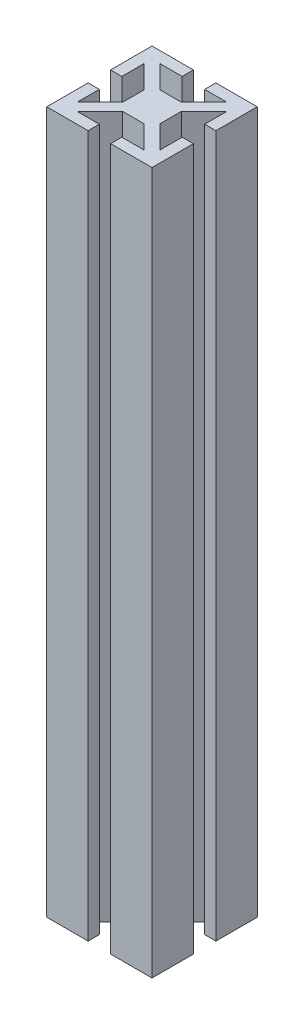
ISO-10303-21;
HEADER;
FILE_DESCRIPTION(('STEP AP214'),'2;1');
FILE_NAME('part.step','',(''),(''),'','','');
FILE_SCHEMA(('AUTOMOTIVE_DESIGN { 1 0 10303 214 1 1 1 1 }'));
ENDSEC;
DATA;
#1=APPLICATION_CONTEXT('core data for automotive mechanical design processes');
#2=APPLICATION_PROTOCOL_DEFINITION('international standard','automotive_design',2000,#1);
#3=PRODUCT_CONTEXT('',#1,'mechanical');
#4=PRODUCT('Part','Part','',(#3));
#5=PRODUCT_RELATED_PRODUCT_CATEGORY('part','',(#4));
#6=PRODUCT_DEFINITION_FORMATION('','',#4);
#7=PRODUCT_DEFINITION_CONTEXT('part definition',#1,'design');
#8=PRODUCT_DEFINITION('design','',#6,#7);
#9=PRODUCT_DEFINITION_SHAPE('','',#8);
#10=(LENGTH_UNIT() NAMED_UNIT(*) SI_UNIT(.MILLI.,.METRE.));
#11=(NAMED_UNIT(*) PLANE_ANGLE_UNIT() SI_UNIT($,.RADIAN.));
#12=(NAMED_UNIT(*) SI_UNIT($,.STERADIAN.) SOLID_ANGLE_UNIT());
#13=UNCERTAINTY_MEASURE_WITH_UNIT(LENGTH_MEASURE(1.E-05),#10,'distance_accuracy_value','');
#14=(GEOMETRIC_REPRESENTATION_CONTEXT(3) GLOBAL_UNCERTAINTY_ASSIGNED_CONTEXT((#13)) GLOBAL_UNIT_ASSIGNED_CONTEXT((#10,
#11,#12)) REPRESENTATION_CONTEXT('',''));
#15=CARTESIAN_POINT('',(0.,0.,0.));
#16=DIRECTION('',(0.,0.,1.));
#17=DIRECTION('',(1.,0.,0.));
#18=AXIS2_PLACEMENT_3D('',#15,#16,#17);
#19=CARTESIAN_POINT('',(-19.05,-254.,-19.05));
#20=DIRECTION('',(-1.,0.,0.));
#21=DIRECTION('',(0.,0.,1.));
#22=AXIS2_PLACEMENT_3D('',#19,#20,#21);
#23=PLANE('',#22);
#24=DIRECTION('',(0.,0.,1.));
#25=VECTOR('',#24,1.);
#26=CARTESIAN_POINT('',(-19.05,0.,-19.05));
#27=LINE('',#26,#25);
#28=CARTESIAN_POINT('',(-19.05,0.,-19.05));
#29=VERTEX_POINT('',#28);
#30=CARTESIAN_POINT('',(-19.05,0.,-4.06399999999998));
#31=VERTEX_POINT('',#30);
#32=EDGE_CURVE('E296',#29,#31,#27,.T.);
#33=ORIENTED_EDGE('',*,*,#32,.F.);
#34=DIRECTION('',(0.,1.,0.));
#35=VECTOR('',#34,1.);
#36=CARTESIAN_POINT('',(-19.05,-254.,-19.05));
#37=LINE('',#36,#35);
#38=CARTESIAN_POINT('',(-19.05,-254.,-19.05));
#39=VERTEX_POINT('',#38);
#40=EDGE_CURVE('E11',#39,#29,#37,.T.);
#41=ORIENTED_EDGE('',*,*,#40,.F.);
#42=DIRECTION('',(0.,0.,1.));
#43=VECTOR('',#42,1.);
#44=CARTESIAN_POINT('',(-19.05,-254.,-19.05));
#45=LINE('',#44,#43);
#46=CARTESIAN_POINT('',(-19.05,-254.,-4.06399999999998));
#47=VERTEX_POINT('',#46);
#48=EDGE_CURVE('E400',#39,#47,#45,.T.);
#49=ORIENTED_EDGE('',*,*,#48,.T.);
#50=DIRECTION('',(0.,1.,0.));
#51=VECTOR('',#50,1.);
#52=CARTESIAN_POINT('',(-19.05,-254.,-4.06399999999998));
#53=LINE('',#52,#51);
#54=EDGE_CURVE('E34',#47,#31,#53,.T.);
#55=ORIENTED_EDGE('',*,*,#54,.T.);
#56=EDGE_LOOP('',(#33,#41,#49,#55));
#57=FACE_BOUND('',#56,.T.);
#58=ADVANCED_FACE('F31',(#57),#23,.T.);
#59=CARTESIAN_POINT('',(-19.05,-254.,-19.05));
#60=DIRECTION('',(0.,0.,-1.));
#61=DIRECTION('',(-1.,0.,0.));
#62=AXIS2_PLACEMENT_3D('',#59,#60,#61);
#63=PLANE('',#62);
#64=DIRECTION('',(-1.,0.,0.));
#65=VECTOR('',#64,1.);
#66=CARTESIAN_POINT('',(-19.05,0.,-19.05));
#67=LINE('',#66,#65);
#68=CARTESIAN_POINT('',(-4.064,0.,-19.05));
#69=VERTEX_POINT('',#68);
#70=EDGE_CURVE('E398',#69,#29,#67,.T.);
#71=ORIENTED_EDGE('',*,*,#70,.F.);
#72=DIRECTION('',(0.,1.,0.));
#73=VECTOR('',#72,1.);
#74=CARTESIAN_POINT('',(-4.064,-254.,-19.05));
#75=LINE('',#74,#73);
#76=CARTESIAN_POINT('',(-4.064,-254.,-19.05));
#77=VERTEX_POINT('',#76);
#78=EDGE_CURVE('E40',#77,#69,#75,.T.);
#79=ORIENTED_EDGE('',*,*,#78,.F.);
#80=DIRECTION('',(-1.,0.,0.));
#81=VECTOR('',#80,1.);
#82=CARTESIAN_POINT('',(-19.05,-254.,-19.05));
#83=LINE('',#82,#81);
#84=EDGE_CURVE('E286',#77,#39,#83,.T.);
#85=ORIENTED_EDGE('',*,*,#84,.T.);
#86=ORIENTED_EDGE('',*,*,#40,.T.);
#87=EDGE_LOOP('',(#71,#79,#85,#86));
#88=FACE_BOUND('',#87,.T.);
#89=ADVANCED_FACE('F468',(#88),#63,.T.);
#90=CARTESIAN_POINT('',(-4.064,-254.,-19.05));
#91=DIRECTION('',(1.,0.,0.));
#92=DIRECTION('',(0.,0.,-1.));
#93=AXIS2_PLACEMENT_3D('',#90,#91,#92);
#94=PLANE('',#93);
#95=DIRECTION('',(0.,0.,-1.));
#96=VECTOR('',#95,1.);
#97=CARTESIAN_POINT('',(-4.064,0.,-19.05));
#98=LINE('',#97,#96);
#99=CARTESIAN_POINT('',(-4.064,0.,-14.986));
#100=VERTEX_POINT('',#99);
#101=EDGE_CURVE('E273',#100,#69,#98,.T.);
#102=ORIENTED_EDGE('',*,*,#101,.F.);
#103=DIRECTION('',(0.,1.,0.));
#104=VECTOR('',#103,1.);
#105=CARTESIAN_POINT('',(-4.064,-254.,-14.986));
#106=LINE('',#105,#104);
#107=CARTESIAN_POINT('',(-4.064,-254.,-14.986));
#108=VERTEX_POINT('',#107);
#109=EDGE_CURVE('E268',#108,#100,#106,.T.);
#110=ORIENTED_EDGE('',*,*,#109,.F.);
#111=DIRECTION('',(0.,0.,-1.));
#112=VECTOR('',#111,1.);
#113=CARTESIAN_POINT('',(-4.064,-254.,-19.05));
#114=LINE('',#113,#112);
#115=EDGE_CURVE('E271',#108,#77,#114,.T.);
#116=ORIENTED_EDGE('',*,*,#115,.T.);
#117=ORIENTED_EDGE('',*,*,#78,.T.);
#118=EDGE_LOOP('',(#102,#110,#116,#117));
#119=FACE_BOUND('',#118,.T.);
#120=ADVANCED_FACE('F270',(#119),#94,.T.);
#121=CARTESIAN_POINT('',(-4.064,-254.,-14.986));
#122=DIRECTION('',(0.,0.,1.));
#123=DIRECTION('',(1.,0.,0.));
#124=AXIS2_PLACEMENT_3D('',#121,#122,#123);
#125=PLANE('',#124);
#126=DIRECTION('',(1.,0.,0.));
#127=VECTOR('',#126,1.);
#128=CARTESIAN_POINT('',(-4.064,0.,-14.986));
#129=LINE('',#128,#127);
#130=CARTESIAN_POINT('',(-12.1123180412579,0.,-14.986));
#131=VERTEX_POINT('',#130);
#132=EDGE_CURVE('E395',#131,#100,#129,.T.);
#133=ORIENTED_EDGE('',*,*,#132,.F.);
#134=DIRECTION('',(0.,1.,0.));
#135=VECTOR('',#134,1.);
#136=CARTESIAN_POINT('',(-12.1123180412579,-254.,-14.986));
#137=LINE('',#136,#135);
#138=CARTESIAN_POINT('',(-12.1123180412579,-254.,-14.986));
#139=VERTEX_POINT('',#138);
#140=EDGE_CURVE('E278',#139,#131,#137,.T.);
#141=ORIENTED_EDGE('',*,*,#140,.F.);
#142=DIRECTION('',(1.,0.,0.));
#143=VECTOR('',#142,1.);
#144=CARTESIAN_POINT('',(-4.064,-254.,-14.986));
#145=LINE('',#144,#143);
#146=EDGE_CURVE('E284',#139,#108,#145,.T.);
#147=ORIENTED_EDGE('',*,*,#146,.T.);
#148=ORIENTED_EDGE('',*,*,#109,.T.);
#149=EDGE_LOOP('',(#133,#141,#147,#148));
#150=FACE_BOUND('',#149,.T.);
#151=ADVANCED_FACE('F288',(#150),#125,.T.);
#152=CARTESIAN_POINT('',(-12.1123180412579,-254.,-14.986));
#153=DIRECTION('',(0.707106781186548,0.,-0.707106781186548));
#154=DIRECTION('',(-0.707106781186548,0.,-0.707106781186548));
#155=AXIS2_PLACEMENT_3D('',#152,#153,#154);
#156=PLANE('',#155);
#157=DIRECTION('',(-0.707106781186548,0.,-0.707106781186548));
#158=VECTOR('',#157,1.);
#159=CARTESIAN_POINT('',(-12.1123180412579,0.,-14.986));
#160=LINE('',#159,#158);
#161=CARTESIAN_POINT('',(-3.88271804125787,0.,-6.75639999999999));
#162=VERTEX_POINT('',#161);
#163=EDGE_CURVE('E392',#162,#131,#160,.T.);
#164=ORIENTED_EDGE('',*,*,#163,.F.);
#165=DIRECTION('',(0.,1.,0.));
#166=VECTOR('',#165,1.);
#167=CARTESIAN_POINT('',(-3.88271804125787,-254.,-6.75639999999999));
#168=LINE('',#167,#166);
#169=CARTESIAN_POINT('',(-3.88271804125787,-254.,-6.75639999999999));
#170=VERTEX_POINT('',#169);
#171=EDGE_CURVE('E404',#170,#162,#168,.T.);
#172=ORIENTED_EDGE('',*,*,#171,.F.);
#173=DIRECTION('',(-0.707106781186548,0.,-0.707106781186548));
#174=VECTOR('',#173,1.);
#175=CARTESIAN_POINT('',(-12.1123180412579,-254.,-14.986));
#176=LINE('',#175,#174);
#177=EDGE_CURVE('E289',#170,#139,#176,.T.);
#178=ORIENTED_EDGE('',*,*,#177,.T.);
#179=ORIENTED_EDGE('',*,*,#140,.T.);
#180=EDGE_LOOP('',(#164,#172,#178,#179));
#181=FACE_BOUND('',#180,.T.);
#182=ADVANCED_FACE('F481',(#181),#156,.T.);
#183=CARTESIAN_POINT('',(-3.88271804125787,-254.,-6.75639999999999));
#184=DIRECTION('',(0.,0.,-1.));
#185=DIRECTION('',(-1.,0.,0.));
#186=AXIS2_PLACEMENT_3D('',#183,#184,#185);
#187=PLANE('',#186);
#188=DIRECTION('',(-1.,0.,0.));
#189=VECTOR('',#188,1.);
#190=CARTESIAN_POINT('',(-3.88271804125787,0.,-6.75639999999999));
#191=LINE('',#190,#189);
#192=CARTESIAN_POINT('',(3.88271804125786,0.,-6.7564));
#193=VERTEX_POINT('',#192);
#194=EDGE_CURVE('E389',#193,#162,#191,.T.);
#195=ORIENTED_EDGE('',*,*,#194,.F.);
#196=DIRECTION('',(0.,1.,0.));
#197=VECTOR('',#196,1.);
#198=CARTESIAN_POINT('',(3.88271804125786,-254.,-6.7564));
#199=LINE('',#198,#197);
#200=CARTESIAN_POINT('',(3.88271804125786,-254.,-6.7564));
#201=VERTEX_POINT('',#200);
#202=EDGE_CURVE('E406',#201,#193,#199,.T.);
#203=ORIENTED_EDGE('',*,*,#202,.F.);
#204=DIRECTION('',(-1.,0.,0.));
#205=VECTOR('',#204,1.);
#206=CARTESIAN_POINT('',(-3.88271804125787,-254.,-6.75639999999999));
#207=LINE('',#206,#205);
#208=EDGE_CURVE('E291',#201,#170,#207,.T.);
#209=ORIENTED_EDGE('',*,*,#208,.T.);
#210=ORIENTED_EDGE('',*,*,#171,.T.);
#211=EDGE_LOOP('',(#195,#203,#209,#210));
#212=FACE_BOUND('',#211,.T.);
#213=ADVANCED_FACE('F484',(#212),#187,.T.);
#214=CARTESIAN_POINT('',(12.1123180412579,-254.,-14.986));
#215=DIRECTION('',(-0.707106781186548,0.,-0.707106781186547));
#216=DIRECTION('',(-0.707106781186547,0.,0.707106781186548));
#217=AXIS2_PLACEMENT_3D('',#214,#215,#216);
#218=PLANE('',#217);
#219=DIRECTION('',(-0.707106781186547,0.,0.707106781186548));
#220=VECTOR('',#219,1.);
#221=CARTESIAN_POINT('',(12.1123180412579,0.,-14.986));
#222=LINE('',#221,#220);
#223=CARTESIAN_POINT('',(12.1123180412579,0.,-14.986));
#224=VERTEX_POINT('',#223);
#225=EDGE_CURVE('E386',#224,#193,#222,.T.);
#226=ORIENTED_EDGE('',*,*,#225,.F.);
#227=DIRECTION('',(0.,1.,0.));
#228=VECTOR('',#227,1.);
#229=CARTESIAN_POINT('',(12.1123180412579,-254.,-14.986));
#230=LINE('',#229,#228);
#231=CARTESIAN_POINT('',(12.1123180412579,-254.,-14.986));
#232=VERTEX_POINT('',#231);
#233=EDGE_CURVE('E408',#232,#224,#230,.T.);
#234=ORIENTED_EDGE('',*,*,#233,.F.);
#235=DIRECTION('',(-0.707106781186547,0.,0.707106781186548));
#236=VECTOR('',#235,1.);
#237=CARTESIAN_POINT('',(12.1123180412579,-254.,-14.986));
#238=LINE('',#237,#236);
#239=EDGE_CURVE('E938',#232,#201,#238,.T.);
#240=ORIENTED_EDGE('',*,*,#239,.T.);
#241=ORIENTED_EDGE('',*,*,#202,.T.);
#242=EDGE_LOOP('',(#226,#234,#240,#241));
#243=FACE_BOUND('',#242,.T.);
#244=ADVANCED_FACE('F488',(#243),#218,.T.);
#245=CARTESIAN_POINT('',(4.06399999999999,-254.,-14.986));
#246=DIRECTION('',(0.,0.,1.));
#247=DIRECTION('',(1.,0.,0.));
#248=AXIS2_PLACEMENT_3D('',#245,#246,#247);
#249=PLANE('',#248);
#250=DIRECTION('',(1.,0.,0.));
#251=VECTOR('',#250,1.);
#252=CARTESIAN_POINT('',(4.06399999999999,0.,-14.986));
#253=LINE('',#252,#251);
#254=CARTESIAN_POINT('',(4.06399999999999,0.,-14.986));
#255=VERTEX_POINT('',#254);
#256=EDGE_CURVE('E383',#255,#224,#253,.T.);
#257=ORIENTED_EDGE('',*,*,#256,.F.);
#258=DIRECTION('',(0.,1.,0.));
#259=VECTOR('',#258,1.);
#260=CARTESIAN_POINT('',(4.06399999999999,-254.,-14.986));
#261=LINE('',#260,#259);
#262=CARTESIAN_POINT('',(4.06399999999999,-254.,-14.986));
#263=VERTEX_POINT('',#262);
#264=EDGE_CURVE('E410',#263,#255,#261,.T.);
#265=ORIENTED_EDGE('',*,*,#264,.F.);
#266=DIRECTION('',(1.,0.,0.));
#267=VECTOR('',#266,1.);
#268=CARTESIAN_POINT('',(4.06399999999999,-254.,-14.986));
#269=LINE('',#268,#267);
#270=EDGE_CURVE('E942',#263,#232,#269,.T.);
#271=ORIENTED_EDGE('',*,*,#270,.T.);
#272=ORIENTED_EDGE('',*,*,#233,.T.);
#273=EDGE_LOOP('',(#257,#265,#271,#272));
#274=FACE_BOUND('',#273,.T.);
#275=ADVANCED_FACE('F492',(#274),#249,.T.);
#276=CARTESIAN_POINT('',(4.06399999999999,-254.,-19.05));
#277=DIRECTION('',(-1.,0.,0.));
#278=DIRECTION('',(0.,0.,1.));
#279=AXIS2_PLACEMENT_3D('',#276,#277,#278);
#280=PLANE('',#279);
#281=DIRECTION('',(0.,0.,1.));
#282=VECTOR('',#281,1.);
#283=CARTESIAN_POINT('',(4.06399999999999,0.,-19.05));
#284=LINE('',#283,#282);
#285=CARTESIAN_POINT('',(4.06399999999999,0.,-19.05));
#286=VERTEX_POINT('',#285);
#287=EDGE_CURVE('E380',#286,#255,#284,.T.);
#288=ORIENTED_EDGE('',*,*,#287,.F.);
#289=DIRECTION('',(0.,1.,0.));
#290=VECTOR('',#289,1.);
#291=CARTESIAN_POINT('',(4.06399999999999,-254.,-19.05));
#292=LINE('',#291,#290);
#293=CARTESIAN_POINT('',(4.06399999999999,-254.,-19.05));
#294=VERTEX_POINT('',#293);
#295=EDGE_CURVE('E412',#294,#286,#292,.T.);
#296=ORIENTED_EDGE('',*,*,#295,.F.);
#297=DIRECTION('',(0.,0.,1.));
#298=VECTOR('',#297,1.);
#299=CARTESIAN_POINT('',(4.06399999999999,-254.,-19.05));
#300=LINE('',#299,#298);
#301=EDGE_CURVE('E931',#294,#263,#300,.T.);
#302=ORIENTED_EDGE('',*,*,#301,.T.);
#303=ORIENTED_EDGE('',*,*,#264,.T.);
#304=EDGE_LOOP('',(#288,#296,#302,#303));
#305=FACE_BOUND('',#304,.T.);
#306=ADVANCED_FACE('F496',(#305),#280,.T.);
#307=CARTESIAN_POINT('',(19.05,-254.,-19.05));
#308=DIRECTION('',(0.,0.,-1.));
#309=DIRECTION('',(-1.,0.,0.));
#310=AXIS2_PLACEMENT_3D('',#307,#308,#309);
#311=PLANE('',#310);
#312=DIRECTION('',(-1.,0.,0.));
#313=VECTOR('',#312,1.);
#314=CARTESIAN_POINT('',(19.05,0.,-19.05));
#315=LINE('',#314,#313);
#316=CARTESIAN_POINT('',(19.05,0.,-19.05));
#317=VERTEX_POINT('',#316);
#318=EDGE_CURVE('E377',#317,#286,#315,.T.);
#319=ORIENTED_EDGE('',*,*,#318,.F.);
#320=DIRECTION('',(0.,1.,0.));
#321=VECTOR('',#320,1.);
#322=CARTESIAN_POINT('',(19.05,-254.,-19.05));
#323=LINE('',#322,#321);
#324=CARTESIAN_POINT('',(19.05,-254.,-19.05));
#325=VERTEX_POINT('',#324);
#326=EDGE_CURVE('E414',#325,#317,#323,.T.);
#327=ORIENTED_EDGE('',*,*,#326,.F.);
#328=DIRECTION('',(-1.,0.,0.));
#329=VECTOR('',#328,1.);
#330=CARTESIAN_POINT('',(19.05,-254.,-19.05));
#331=LINE('',#330,#329);
#332=EDGE_CURVE('E927',#325,#294,#331,.T.);
#333=ORIENTED_EDGE('',*,*,#332,.T.);
#334=ORIENTED_EDGE('',*,*,#295,.T.);
#335=EDGE_LOOP('',(#319,#327,#333,#334));
#336=FACE_BOUND('',#335,.T.);
#337=ADVANCED_FACE('F500',(#336),#311,.T.);
#338=CARTESIAN_POINT('',(19.05,-254.,-19.05));
#339=DIRECTION('',(1.,0.,0.));
#340=DIRECTION('',(0.,0.,-1.));
#341=AXIS2_PLACEMENT_3D('',#338,#339,#340);
#342=PLANE('',#341);
#343=DIRECTION('',(0.,0.,-1.));
#344=VECTOR('',#343,1.);
#345=CARTESIAN_POINT('',(19.05,0.,-19.05));
#346=LINE('',#345,#344);
#347=CARTESIAN_POINT('',(19.05,0.,-4.06399999999999));
#348=VERTEX_POINT('',#347);
#349=EDGE_CURVE('E374',#348,#317,#346,.T.);
#350=ORIENTED_EDGE('',*,*,#349,.F.);
#351=DIRECTION('',(0.,1.,0.));
#352=VECTOR('',#351,1.);
#353=CARTESIAN_POINT('',(19.05,-254.,-4.06399999999999));
#354=LINE('',#353,#352);
#355=CARTESIAN_POINT('',(19.05,-254.,-4.06399999999999));
#356=VERTEX_POINT('',#355);
#357=EDGE_CURVE('E416',#356,#348,#354,.T.);
#358=ORIENTED_EDGE('',*,*,#357,.F.);
#359=DIRECTION('',(0.,0.,-1.));
#360=VECTOR('',#359,1.);
#361=CARTESIAN_POINT('',(19.05,-254.,-19.05));
#362=LINE('',#361,#360);
#363=EDGE_CURVE('E948',#356,#325,#362,.T.);
#364=ORIENTED_EDGE('',*,*,#363,.T.);
#365=ORIENTED_EDGE('',*,*,#326,.T.);
#366=EDGE_LOOP('',(#350,#358,#364,#365));
#367=FACE_BOUND('',#366,.T.);
#368=ADVANCED_FACE('F504',(#367),#342,.T.);
#369=CARTESIAN_POINT('',(19.05,-254.,-4.06399999999999));
#370=DIRECTION('',(0.,0.,1.));
#371=DIRECTION('',(1.,0.,0.));
#372=AXIS2_PLACEMENT_3D('',#369,#370,#371);
#373=PLANE('',#372);
#374=DIRECTION('',(1.,0.,0.));
#375=VECTOR('',#374,1.);
#376=CARTESIAN_POINT('',(19.05,0.,-4.06399999999999));
#377=LINE('',#376,#375);
#378=CARTESIAN_POINT('',(14.986,0.,-4.06399999999999));
#379=VERTEX_POINT('',#378);
#380=EDGE_CURVE('E371',#379,#348,#377,.T.);
#381=ORIENTED_EDGE('',*,*,#380,.F.);
#382=DIRECTION('',(0.,1.,0.));
#383=VECTOR('',#382,1.);
#384=CARTESIAN_POINT('',(14.986,-254.,-4.06399999999999));
#385=LINE('',#384,#383);
#386=CARTESIAN_POINT('',(14.986,-254.,-4.06399999999999));
#387=VERTEX_POINT('',#386);
#388=EDGE_CURVE('E418',#387,#379,#385,.T.);
#389=ORIENTED_EDGE('',*,*,#388,.F.);
#390=DIRECTION('',(1.,0.,0.));
#391=VECTOR('',#390,1.);
#392=CARTESIAN_POINT('',(19.05,-254.,-4.06399999999999));
#393=LINE('',#392,#391);
#394=EDGE_CURVE('E920',#387,#356,#393,.T.);
#395=ORIENTED_EDGE('',*,*,#394,.T.);
#396=ORIENTED_EDGE('',*,*,#357,.T.);
#397=EDGE_LOOP('',(#381,#389,#395,#396));
#398=FACE_BOUND('',#397,.T.);
#399=ADVANCED_FACE('F508',(#398),#373,.T.);
#400=CARTESIAN_POINT('',(14.986,-254.,-4.06399999999999));
#401=DIRECTION('',(-1.,0.,0.));
#402=DIRECTION('',(0.,0.,1.));
#403=AXIS2_PLACEMENT_3D('',#400,#401,#402);
#404=PLANE('',#403);
#405=DIRECTION('',(0.,0.,1.));
#406=VECTOR('',#405,1.);
#407=CARTESIAN_POINT('',(14.986,0.,-4.06399999999999));
#408=LINE('',#407,#406);
#409=CARTESIAN_POINT('',(14.986,0.,-12.1123180412579));
#410=VERTEX_POINT('',#409);
#411=EDGE_CURVE('E368',#410,#379,#408,.T.);
#412=ORIENTED_EDGE('',*,*,#411,.F.);
#413=DIRECTION('',(0.,1.,0.));
#414=VECTOR('',#413,1.);
#415=CARTESIAN_POINT('',(14.986,-254.,-12.1123180412579));
#416=LINE('',#415,#414);
#417=CARTESIAN_POINT('',(14.986,-254.,-12.1123180412579));
#418=VERTEX_POINT('',#417);
#419=EDGE_CURVE('E420',#418,#410,#416,.T.);
#420=ORIENTED_EDGE('',*,*,#419,.F.);
#421=DIRECTION('',(0.,0.,1.));
#422=VECTOR('',#421,1.);
#423=CARTESIAN_POINT('',(14.986,-254.,-4.06399999999999));
#424=LINE('',#423,#422);
#425=EDGE_CURVE('E916',#418,#387,#424,.T.);
#426=ORIENTED_EDGE('',*,*,#425,.T.);
#427=ORIENTED_EDGE('',*,*,#388,.T.);
#428=EDGE_LOOP('',(#412,#420,#426,#427));
#429=FACE_BOUND('',#428,.T.);
#430=ADVANCED_FACE('F512',(#429),#404,.T.);
#431=CARTESIAN_POINT('',(14.986,-254.,-12.1123180412579));
#432=DIRECTION('',(0.707106781186547,0.,0.707106781186548));
#433=DIRECTION('',(0.707106781186548,0.,-0.707106781186547));
#434=AXIS2_PLACEMENT_3D('',#431,#432,#433);
#435=PLANE('',#434);
#436=DIRECTION('',(0.707106781186548,0.,-0.707106781186547));
#437=VECTOR('',#436,1.);
#438=CARTESIAN_POINT('',(14.986,0.,-12.1123180412579));
#439=LINE('',#438,#437);
#440=CARTESIAN_POINT('',(6.75639999999999,0.,-3.88271804125787));
#441=VERTEX_POINT('',#440);
#442=EDGE_CURVE('E365',#441,#410,#439,.T.);
#443=ORIENTED_EDGE('',*,*,#442,.F.);
#444=DIRECTION('',(0.,1.,0.));
#445=VECTOR('',#444,1.);
#446=CARTESIAN_POINT('',(6.75639999999999,-254.,-3.88271804125787));
#447=LINE('',#446,#445);
#448=CARTESIAN_POINT('',(6.75639999999999,-254.,-3.88271804125787));
#449=VERTEX_POINT('',#448);
#450=EDGE_CURVE('E422',#449,#441,#447,.T.);
#451=ORIENTED_EDGE('',*,*,#450,.F.);
#452=DIRECTION('',(0.707106781186548,0.,-0.707106781186547));
#453=VECTOR('',#452,1.);
#454=CARTESIAN_POINT('',(14.986,-254.,-12.1123180412579));
#455=LINE('',#454,#453);
#456=EDGE_CURVE('E952',#449,#418,#455,.T.);
#457=ORIENTED_EDGE('',*,*,#456,.T.);
#458=ORIENTED_EDGE('',*,*,#419,.T.);
#459=EDGE_LOOP('',(#443,#451,#457,#458));
#460=FACE_BOUND('',#459,.T.);
#461=ADVANCED_FACE('F516',(#460),#435,.T.);
#462=CARTESIAN_POINT('',(6.75639999999999,-254.,-3.88271804125787));
#463=DIRECTION('',(1.,0.,0.));
#464=DIRECTION('',(0.,0.,-1.));
#465=AXIS2_PLACEMENT_3D('',#462,#463,#464);
#466=PLANE('',#465);
#467=DIRECTION('',(0.,0.,-1.));
#468=VECTOR('',#467,1.);
#469=CARTESIAN_POINT('',(6.75639999999999,0.,-3.88271804125787));
#470=LINE('',#469,#468);
#471=CARTESIAN_POINT('',(6.7564,0.,3.88271804125787));
#472=VERTEX_POINT('',#471);
#473=EDGE_CURVE('E362',#472,#441,#470,.T.);
#474=ORIENTED_EDGE('',*,*,#473,.F.);
#475=DIRECTION('',(0.,1.,0.));
#476=VECTOR('',#475,1.);
#477=CARTESIAN_POINT('',(6.7564,-254.,3.88271804125787));
#478=LINE('',#477,#476);
#479=CARTESIAN_POINT('',(6.7564,-254.,3.88271804125787));
#480=VERTEX_POINT('',#479);
#481=EDGE_CURVE('E424',#480,#472,#478,.T.);
#482=ORIENTED_EDGE('',*,*,#481,.F.);
#483=DIRECTION('',(0.,0.,-1.));
#484=VECTOR('',#483,1.);
#485=CARTESIAN_POINT('',(6.75639999999999,-254.,-3.88271804125787));
#486=LINE('',#485,#484);
#487=EDGE_CURVE('E909',#480,#449,#486,.T.);
#488=ORIENTED_EDGE('',*,*,#487,.T.);
#489=ORIENTED_EDGE('',*,*,#450,.T.);
#490=EDGE_LOOP('',(#474,#482,#488,#489));
#491=FACE_BOUND('',#490,.T.);
#492=ADVANCED_FACE('F520',(#491),#466,.T.);
#493=CARTESIAN_POINT('',(14.986,-254.,12.1123180412579));
#494=DIRECTION('',(0.707106781186547,0.,-0.707106781186548));
#495=DIRECTION('',(-0.707106781186548,0.,-0.707106781186547));
#496=AXIS2_PLACEMENT_3D('',#493,#494,#495);
#497=PLANE('',#496);
#498=DIRECTION('',(-0.707106781186548,0.,-0.707106781186547));
#499=VECTOR('',#498,1.);
#500=CARTESIAN_POINT('',(14.986,0.,12.1123180412579));
#501=LINE('',#500,#499);
#502=CARTESIAN_POINT('',(14.986,0.,12.1123180412579));
#503=VERTEX_POINT('',#502);
#504=EDGE_CURVE('E359',#503,#472,#501,.T.);
#505=ORIENTED_EDGE('',*,*,#504,.F.);
#506=DIRECTION('',(0.,1.,0.));
#507=VECTOR('',#506,1.);
#508=CARTESIAN_POINT('',(14.986,-254.,12.1123180412579));
#509=LINE('',#508,#507);
#510=CARTESIAN_POINT('',(14.986,-254.,12.1123180412579));
#511=VERTEX_POINT('',#510);
#512=EDGE_CURVE('E426',#511,#503,#509,.T.);
#513=ORIENTED_EDGE('',*,*,#512,.F.);
#514=DIRECTION('',(-0.707106781186548,0.,-0.707106781186547));
#515=VECTOR('',#514,1.);
#516=CARTESIAN_POINT('',(14.986,-254.,12.1123180412579));
#517=LINE('',#516,#515);
#518=EDGE_CURVE('E905',#511,#480,#517,.T.);
#519=ORIENTED_EDGE('',*,*,#518,.T.);
#520=ORIENTED_EDGE('',*,*,#481,.T.);
#521=EDGE_LOOP('',(#505,#513,#519,#520));
#522=FACE_BOUND('',#521,.T.);
#523=ADVANCED_FACE('F524',(#522),#497,.T.);
#524=CARTESIAN_POINT('',(14.986,-254.,4.06399999999999));
#525=DIRECTION('',(-1.,0.,0.));
#526=DIRECTION('',(0.,0.,1.));
#527=AXIS2_PLACEMENT_3D('',#524,#525,#526);
#528=PLANE('',#527);
#529=DIRECTION('',(0.,0.,1.));
#530=VECTOR('',#529,1.);
#531=CARTESIAN_POINT('',(14.986,0.,4.06399999999999));
#532=LINE('',#531,#530);
#533=CARTESIAN_POINT('',(14.986,0.,4.06399999999999));
#534=VERTEX_POINT('',#533);
#535=EDGE_CURVE('E356',#534,#503,#532,.T.);
#536=ORIENTED_EDGE('',*,*,#535,.F.);
#537=DIRECTION('',(0.,1.,0.));
#538=VECTOR('',#537,1.);
#539=CARTESIAN_POINT('',(14.986,-254.,4.06399999999999));
#540=LINE('',#539,#538);
#541=CARTESIAN_POINT('',(14.986,-254.,4.06399999999999));
#542=VERTEX_POINT('',#541);
#543=EDGE_CURVE('E428',#542,#534,#540,.T.);
#544=ORIENTED_EDGE('',*,*,#543,.F.);
#545=DIRECTION('',(0.,0.,1.));
#546=VECTOR('',#545,1.);
#547=CARTESIAN_POINT('',(14.986,-254.,4.06399999999999));
#548=LINE('',#547,#546);
#549=EDGE_CURVE('E956',#542,#511,#548,.T.);
#550=ORIENTED_EDGE('',*,*,#549,.T.);
#551=ORIENTED_EDGE('',*,*,#512,.T.);
#552=EDGE_LOOP('',(#536,#544,#550,#551));
#553=FACE_BOUND('',#552,.T.);
#554=ADVANCED_FACE('F528',(#553),#528,.T.);
#555=CARTESIAN_POINT('',(19.05,-254.,4.06399999999999));
#556=DIRECTION('',(0.,0.,-1.));
#557=DIRECTION('',(-1.,0.,0.));
#558=AXIS2_PLACEMENT_3D('',#555,#556,#557);
#559=PLANE('',#558);
#560=DIRECTION('',(-1.,0.,0.));
#561=VECTOR('',#560,1.);
#562=CARTESIAN_POINT('',(19.05,0.,4.06399999999999));
#563=LINE('',#562,#561);
#564=CARTESIAN_POINT('',(19.05,0.,4.06399999999999));
#565=VERTEX_POINT('',#564);
#566=EDGE_CURVE('E353',#565,#534,#563,.T.);
#567=ORIENTED_EDGE('',*,*,#566,.F.);
#568=DIRECTION('',(0.,1.,0.));
#569=VECTOR('',#568,1.);
#570=CARTESIAN_POINT('',(19.05,-254.,4.06399999999999));
#571=LINE('',#570,#569);
#572=CARTESIAN_POINT('',(19.05,-254.,4.06399999999999));
#573=VERTEX_POINT('',#572);
#574=EDGE_CURVE('E430',#573,#565,#571,.T.);
#575=ORIENTED_EDGE('',*,*,#574,.F.);
#576=DIRECTION('',(-1.,0.,0.));
#577=VECTOR('',#576,1.);
#578=CARTESIAN_POINT('',(19.05,-254.,4.06399999999999));
#579=LINE('',#578,#577);
#580=EDGE_CURVE('E898',#573,#542,#579,.T.);
#581=ORIENTED_EDGE('',*,*,#580,.T.);
#582=ORIENTED_EDGE('',*,*,#543,.T.);
#583=EDGE_LOOP('',(#567,#575,#581,#582));
#584=FACE_BOUND('',#583,.T.);
#585=ADVANCED_FACE('F532',(#584),#559,.T.);
#586=CARTESIAN_POINT('',(19.05,-254.,19.05));
#587=DIRECTION('',(1.,0.,0.));
#588=DIRECTION('',(0.,0.,-1.));
#589=AXIS2_PLACEMENT_3D('',#586,#587,#588);
#590=PLANE('',#589);
#591=DIRECTION('',(0.,0.,-1.));
#592=VECTOR('',#591,1.);
#593=CARTESIAN_POINT('',(19.05,0.,19.05));
#594=LINE('',#593,#592);
#595=CARTESIAN_POINT('',(19.05,0.,19.05));
#596=VERTEX_POINT('',#595);
#597=EDGE_CURVE('E350',#596,#565,#594,.T.);
#598=ORIENTED_EDGE('',*,*,#597,.F.);
#599=DIRECTION('',(0.,1.,0.));
#600=VECTOR('',#599,1.);
#601=CARTESIAN_POINT('',(19.05,-254.,19.05));
#602=LINE('',#601,#600);
#603=CARTESIAN_POINT('',(19.05,-254.,19.05));
#604=VERTEX_POINT('',#603);
#605=EDGE_CURVE('E432',#604,#596,#602,.T.);
#606=ORIENTED_EDGE('',*,*,#605,.F.);
#607=DIRECTION('',(0.,0.,-1.));
#608=VECTOR('',#607,1.);
#609=CARTESIAN_POINT('',(19.05,-254.,19.05));
#610=LINE('',#609,#608);
#611=EDGE_CURVE('E894',#604,#573,#610,.T.);
#612=ORIENTED_EDGE('',*,*,#611,.T.);
#613=ORIENTED_EDGE('',*,*,#574,.T.);
#614=EDGE_LOOP('',(#598,#606,#612,#613));
#615=FACE_BOUND('',#614,.T.);
#616=ADVANCED_FACE('F536',(#615),#590,.T.);
#617=CARTESIAN_POINT('',(19.05,-254.,19.05));
#618=DIRECTION('',(0.,0.,1.));
#619=DIRECTION('',(1.,0.,0.));
#620=AXIS2_PLACEMENT_3D('',#617,#618,#619);
#621=PLANE('',#620);
#622=DIRECTION('',(1.,0.,0.));
#623=VECTOR('',#622,1.);
#624=CARTESIAN_POINT('',(19.05,0.,19.05));
#625=LINE('',#624,#623);
#626=CARTESIAN_POINT('',(4.064,0.,19.05));
#627=VERTEX_POINT('',#626);
#628=EDGE_CURVE('E347',#627,#596,#625,.T.);
#629=ORIENTED_EDGE('',*,*,#628,.F.);
#630=DIRECTION('',(0.,1.,0.));
#631=VECTOR('',#630,1.);
#632=CARTESIAN_POINT('',(4.064,-254.,19.05));
#633=LINE('',#632,#631);
#634=CARTESIAN_POINT('',(4.064,-254.,19.05));
#635=VERTEX_POINT('',#634);
#636=EDGE_CURVE('E434',#635,#627,#633,.T.);
#637=ORIENTED_EDGE('',*,*,#636,.F.);
#638=DIRECTION('',(1.,0.,0.));
#639=VECTOR('',#638,1.);
#640=CARTESIAN_POINT('',(19.05,-254.,19.05));
#641=LINE('',#640,#639);
#642=EDGE_CURVE('E960',#635,#604,#641,.T.);
#643=ORIENTED_EDGE('',*,*,#642,.T.);
#644=ORIENTED_EDGE('',*,*,#605,.T.);
#645=EDGE_LOOP('',(#629,#637,#643,#644));
#646=FACE_BOUND('',#645,.T.);
#647=ADVANCED_FACE('F540',(#646),#621,.T.);
#648=CARTESIAN_POINT('',(4.064,-254.,19.05));
#649=DIRECTION('',(-1.,0.,0.));
#650=DIRECTION('',(0.,0.,1.));
#651=AXIS2_PLACEMENT_3D('',#648,#649,#650);
#652=PLANE('',#651);
#653=DIRECTION('',(0.,0.,1.));
#654=VECTOR('',#653,1.);
#655=CARTESIAN_POINT('',(4.064,0.,19.05));
#656=LINE('',#655,#654);
#657=CARTESIAN_POINT('',(4.064,0.,14.986));
#658=VERTEX_POINT('',#657);
#659=EDGE_CURVE('E344',#658,#627,#656,.T.);
#660=ORIENTED_EDGE('',*,*,#659,.F.);
#661=DIRECTION('',(0.,1.,0.));
#662=VECTOR('',#661,1.);
#663=CARTESIAN_POINT('',(4.064,-254.,14.986));
#664=LINE('',#663,#662);
#665=CARTESIAN_POINT('',(4.064,-254.,14.986));
#666=VERTEX_POINT('',#665);
#667=EDGE_CURVE('E436',#666,#658,#664,.T.);
#668=ORIENTED_EDGE('',*,*,#667,.F.);
#669=DIRECTION('',(0.,0.,1.));
#670=VECTOR('',#669,1.);
#671=CARTESIAN_POINT('',(4.064,-254.,19.05));
#672=LINE('',#671,#670);
#673=EDGE_CURVE('E887',#666,#635,#672,.T.);
#674=ORIENTED_EDGE('',*,*,#673,.T.);
#675=ORIENTED_EDGE('',*,*,#636,.T.);
#676=EDGE_LOOP('',(#660,#668,#674,#675));
#677=FACE_BOUND('',#676,.T.);
#678=ADVANCED_FACE('F544',(#677),#652,.T.);
#679=CARTESIAN_POINT('',(4.064,-254.,14.986));
#680=DIRECTION('',(0.,0.,-1.));
#681=DIRECTION('',(-1.,0.,0.));
#682=AXIS2_PLACEMENT_3D('',#679,#680,#681);
#683=PLANE('',#682);
#684=DIRECTION('',(-1.,0.,0.));
#685=VECTOR('',#684,1.);
#686=CARTESIAN_POINT('',(4.064,0.,14.986));
#687=LINE('',#686,#685);
#688=CARTESIAN_POINT('',(12.1123180412579,0.,14.986));
#689=VERTEX_POINT('',#688);
#690=EDGE_CURVE('E341',#689,#658,#687,.T.);
#691=ORIENTED_EDGE('',*,*,#690,.F.);
#692=DIRECTION('',(0.,1.,0.));
#693=VECTOR('',#692,1.);
#694=CARTESIAN_POINT('',(12.1123180412579,-254.,14.986));
#695=LINE('',#694,#693);
#696=CARTESIAN_POINT('',(12.1123180412579,-254.,14.986));
#697=VERTEX_POINT('',#696);
#698=EDGE_CURVE('E438',#697,#689,#695,.T.);
#699=ORIENTED_EDGE('',*,*,#698,.F.);
#700=DIRECTION('',(-1.,0.,0.));
#701=VECTOR('',#700,1.);
#702=CARTESIAN_POINT('',(4.064,-254.,14.986));
#703=LINE('',#702,#701);
#704=EDGE_CURVE('E883',#697,#666,#703,.T.);
#705=ORIENTED_EDGE('',*,*,#704,.T.);
#706=ORIENTED_EDGE('',*,*,#667,.T.);
#707=EDGE_LOOP('',(#691,#699,#705,#706));
#708=FACE_BOUND('',#707,.T.);
#709=ADVANCED_FACE('F548',(#708),#683,.T.);
#710=CARTESIAN_POINT('',(12.1123180412579,-254.,14.986));
#711=DIRECTION('',(-0.707106781186548,0.,0.707106781186547));
#712=DIRECTION('',(0.707106781186547,0.,0.707106781186548));
#713=AXIS2_PLACEMENT_3D('',#710,#711,#712);
#714=PLANE('',#713);
#715=DIRECTION('',(0.707106781186547,0.,0.707106781186548));
#716=VECTOR('',#715,1.);
#717=CARTESIAN_POINT('',(12.1123180412579,0.,14.986));
#718=LINE('',#717,#716);
#719=CARTESIAN_POINT('',(3.88271804125787,0.,6.75639999999999));
#720=VERTEX_POINT('',#719);
#721=EDGE_CURVE('E338',#720,#689,#718,.T.);
#722=ORIENTED_EDGE('',*,*,#721,.F.);
#723=DIRECTION('',(0.,1.,0.));
#724=VECTOR('',#723,1.);
#725=CARTESIAN_POINT('',(3.88271804125787,-254.,6.75639999999999));
#726=LINE('',#725,#724);
#727=CARTESIAN_POINT('',(3.88271804125787,-254.,6.75639999999999));
#728=VERTEX_POINT('',#727);
#729=EDGE_CURVE('E440',#728,#720,#726,.T.);
#730=ORIENTED_EDGE('',*,*,#729,.F.);
#731=DIRECTION('',(0.707106781186547,0.,0.707106781186548));
#732=VECTOR('',#731,1.);
#733=CARTESIAN_POINT('',(12.1123180412579,-254.,14.986));
#734=LINE('',#733,#732);
#735=EDGE_CURVE('E964',#728,#697,#734,.T.);
#736=ORIENTED_EDGE('',*,*,#735,.T.);
#737=ORIENTED_EDGE('',*,*,#698,.T.);
#738=EDGE_LOOP('',(#722,#730,#736,#737));
#739=FACE_BOUND('',#738,.T.);
#740=ADVANCED_FACE('F552',(#739),#714,.T.);
#741=CARTESIAN_POINT('',(-3.88271804125787,-254.,6.75639999999999));
#742=DIRECTION('',(0.,0.,1.));
#743=DIRECTION('',(1.,0.,0.));
#744=AXIS2_PLACEMENT_3D('',#741,#742,#743);
#745=PLANE('',#744);
#746=DIRECTION('',(1.,0.,0.));
#747=VECTOR('',#746,1.);
#748=CARTESIAN_POINT('',(-3.88271804125787,0.,6.75639999999999));
#749=LINE('',#748,#747);
#750=CARTESIAN_POINT('',(-3.88271804125787,0.,6.75639999999999));
#751=VERTEX_POINT('',#750);
#752=EDGE_CURVE('E335',#751,#720,#749,.T.);
#753=ORIENTED_EDGE('',*,*,#752,.F.);
#754=DIRECTION('',(0.,1.,0.));
#755=VECTOR('',#754,1.);
#756=CARTESIAN_POINT('',(-3.88271804125787,-254.,6.75639999999999));
#757=LINE('',#756,#755);
#758=CARTESIAN_POINT('',(-3.88271804125787,-254.,6.75639999999999));
#759=VERTEX_POINT('',#758);
#760=EDGE_CURVE('E442',#759,#751,#757,.T.);
#761=ORIENTED_EDGE('',*,*,#760,.F.);
#762=DIRECTION('',(1.,0.,0.));
#763=VECTOR('',#762,1.);
#764=CARTESIAN_POINT('',(-3.88271804125787,-254.,6.75639999999999));
#765=LINE('',#764,#763);
#766=EDGE_CURVE('E876',#759,#728,#765,.T.);
#767=ORIENTED_EDGE('',*,*,#766,.T.);
#768=ORIENTED_EDGE('',*,*,#729,.T.);
#769=EDGE_LOOP('',(#753,#761,#767,#768));
#770=FACE_BOUND('',#769,.T.);
#771=ADVANCED_FACE('F556',(#770),#745,.T.);
#772=CARTESIAN_POINT('',(-12.1123180412579,-254.,14.986));
#773=DIRECTION('',(0.707106781186548,0.,0.707106781186547));
#774=DIRECTION('',(0.707106781186547,0.,-0.707106781186548));
#775=AXIS2_PLACEMENT_3D('',#772,#773,#774);
#776=PLANE('',#775);
#777=DIRECTION('',(0.707106781186547,0.,-0.707106781186548));
#778=VECTOR('',#777,1.);
#779=CARTESIAN_POINT('',(-12.1123180412579,0.,14.986));
#780=LINE('',#779,#778);
#781=CARTESIAN_POINT('',(-12.1123180412579,0.,14.986));
#782=VERTEX_POINT('',#781);
#783=EDGE_CURVE('E332',#782,#751,#780,.T.);
#784=ORIENTED_EDGE('',*,*,#783,.F.);
#785=DIRECTION('',(0.,1.,0.));
#786=VECTOR('',#785,1.);
#787=CARTESIAN_POINT('',(-12.1123180412579,-254.,14.986));
#788=LINE('',#787,#786);
#789=CARTESIAN_POINT('',(-12.1123180412579,-254.,14.986));
#790=VERTEX_POINT('',#789);
#791=EDGE_CURVE('E444',#790,#782,#788,.T.);
#792=ORIENTED_EDGE('',*,*,#791,.F.);
#793=DIRECTION('',(0.707106781186547,0.,-0.707106781186548));
#794=VECTOR('',#793,1.);
#795=CARTESIAN_POINT('',(-12.1123180412579,-254.,14.986));
#796=LINE('',#795,#794);
#797=EDGE_CURVE('E872',#790,#759,#796,.T.);
#798=ORIENTED_EDGE('',*,*,#797,.T.);
#799=ORIENTED_EDGE('',*,*,#760,.T.);
#800=EDGE_LOOP('',(#784,#792,#798,#799));
#801=FACE_BOUND('',#800,.T.);
#802=ADVANCED_FACE('F560',(#801),#776,.T.);
#803=CARTESIAN_POINT('',(-4.064,-254.,14.986));
#804=DIRECTION('',(0.,0.,-1.));
#805=DIRECTION('',(-1.,0.,0.));
#806=AXIS2_PLACEMENT_3D('',#803,#804,#805);
#807=PLANE('',#806);
#808=DIRECTION('',(-1.,0.,0.));
#809=VECTOR('',#808,1.);
#810=CARTESIAN_POINT('',(-4.064,0.,14.986));
#811=LINE('',#810,#809);
#812=CARTESIAN_POINT('',(-4.064,0.,14.986));
#813=VERTEX_POINT('',#812);
#814=EDGE_CURVE('E329',#813,#782,#811,.T.);
#815=ORIENTED_EDGE('',*,*,#814,.F.);
#816=DIRECTION('',(0.,1.,0.));
#817=VECTOR('',#816,1.);
#818=CARTESIAN_POINT('',(-4.064,-254.,14.986));
#819=LINE('',#818,#817);
#820=CARTESIAN_POINT('',(-4.064,-254.,14.986));
#821=VERTEX_POINT('',#820);
#822=EDGE_CURVE('E446',#821,#813,#819,.T.);
#823=ORIENTED_EDGE('',*,*,#822,.F.);
#824=DIRECTION('',(-1.,0.,0.));
#825=VECTOR('',#824,1.);
#826=CARTESIAN_POINT('',(-4.064,-254.,14.986));
#827=LINE('',#826,#825);
#828=EDGE_CURVE('E968',#821,#790,#827,.T.);
#829=ORIENTED_EDGE('',*,*,#828,.T.);
#830=ORIENTED_EDGE('',*,*,#791,.T.);
#831=EDGE_LOOP('',(#815,#823,#829,#830));
#832=FACE_BOUND('',#831,.T.);
#833=ADVANCED_FACE('F564',(#832),#807,.T.);
#834=CARTESIAN_POINT('',(-4.064,-254.,19.05));
#835=DIRECTION('',(1.,0.,0.));
#836=DIRECTION('',(0.,0.,-1.));
#837=AXIS2_PLACEMENT_3D('',#834,#835,#836);
#838=PLANE('',#837);
#839=DIRECTION('',(0.,0.,-1.));
#840=VECTOR('',#839,1.);
#841=CARTESIAN_POINT('',(-4.064,0.,19.05));
#842=LINE('',#841,#840);
#843=CARTESIAN_POINT('',(-4.064,0.,19.05));
#844=VERTEX_POINT('',#843);
#845=EDGE_CURVE('E326',#844,#813,#842,.T.);
#846=ORIENTED_EDGE('',*,*,#845,.F.);
#847=DIRECTION('',(0.,1.,0.));
#848=VECTOR('',#847,1.);
#849=CARTESIAN_POINT('',(-4.064,-254.,19.05));
#850=LINE('',#849,#848);
#851=CARTESIAN_POINT('',(-4.064,-254.,19.05));
#852=VERTEX_POINT('',#851);
#853=EDGE_CURVE('E448',#852,#844,#850,.T.);
#854=ORIENTED_EDGE('',*,*,#853,.F.);
#855=DIRECTION('',(0.,0.,-1.));
#856=VECTOR('',#855,1.);
#857=CARTESIAN_POINT('',(-4.064,-254.,19.05));
#858=LINE('',#857,#856);
#859=EDGE_CURVE('E865',#852,#821,#858,.T.);
#860=ORIENTED_EDGE('',*,*,#859,.T.);
#861=ORIENTED_EDGE('',*,*,#822,.T.);
#862=EDGE_LOOP('',(#846,#854,#860,#861));
#863=FACE_BOUND('',#862,.T.);
#864=ADVANCED_FACE('F568',(#863),#838,.T.);
#865=CARTESIAN_POINT('',(-19.05,-254.,19.05));
#866=DIRECTION('',(0.,0.,1.));
#867=DIRECTION('',(1.,0.,0.));
#868=AXIS2_PLACEMENT_3D('',#865,#866,#867);
#869=PLANE('',#868);
#870=DIRECTION('',(1.,0.,0.));
#871=VECTOR('',#870,1.);
#872=CARTESIAN_POINT('',(-19.05,0.,19.05));
#873=LINE('',#872,#871);
#874=CARTESIAN_POINT('',(-19.05,0.,19.05));
#875=VERTEX_POINT('',#874);
#876=EDGE_CURVE('E323',#875,#844,#873,.T.);
#877=ORIENTED_EDGE('',*,*,#876,.F.);
#878=DIRECTION('',(0.,1.,0.));
#879=VECTOR('',#878,1.);
#880=CARTESIAN_POINT('',(-19.05,-254.,19.05));
#881=LINE('',#880,#879);
#882=CARTESIAN_POINT('',(-19.05,-254.,19.05));
#883=VERTEX_POINT('',#882);
#884=EDGE_CURVE('E450',#883,#875,#881,.T.);
#885=ORIENTED_EDGE('',*,*,#884,.F.);
#886=DIRECTION('',(1.,0.,0.));
#887=VECTOR('',#886,1.);
#888=CARTESIAN_POINT('',(-19.05,-254.,19.05));
#889=LINE('',#888,#887);
#890=EDGE_CURVE('E861',#883,#852,#889,.T.);
#891=ORIENTED_EDGE('',*,*,#890,.T.);
#892=ORIENTED_EDGE('',*,*,#853,.T.);
#893=EDGE_LOOP('',(#877,#885,#891,#892));
#894=FACE_BOUND('',#893,.T.);
#895=ADVANCED_FACE('F572',(#894),#869,.T.);
#896=CARTESIAN_POINT('',(-19.05,-254.,19.05));
#897=DIRECTION('',(-1.,0.,0.));
#898=DIRECTION('',(0.,0.,1.));
#899=AXIS2_PLACEMENT_3D('',#896,#897,#898);
#900=PLANE('',#899);
#901=DIRECTION('',(0.,0.,1.));
#902=VECTOR('',#901,1.);
#903=CARTESIAN_POINT('',(-19.05,0.,19.05));
#904=LINE('',#903,#902);
#905=CARTESIAN_POINT('',(-19.05,0.,4.06399999999999));
#906=VERTEX_POINT('',#905);
#907=EDGE_CURVE('E320',#906,#875,#904,.T.);
#908=ORIENTED_EDGE('',*,*,#907,.F.);
#909=DIRECTION('',(0.,1.,0.));
#910=VECTOR('',#909,1.);
#911=CARTESIAN_POINT('',(-19.05,-254.,4.06399999999999));
#912=LINE('',#911,#910);
#913=CARTESIAN_POINT('',(-19.05,-254.,4.06399999999999));
#914=VERTEX_POINT('',#913);
#915=EDGE_CURVE('E452',#914,#906,#912,.T.);
#916=ORIENTED_EDGE('',*,*,#915,.F.);
#917=DIRECTION('',(0.,0.,1.));
#918=VECTOR('',#917,1.);
#919=CARTESIAN_POINT('',(-19.05,-254.,19.05));
#920=LINE('',#919,#918);
#921=EDGE_CURVE('E972',#914,#883,#920,.T.);
#922=ORIENTED_EDGE('',*,*,#921,.T.);
#923=ORIENTED_EDGE('',*,*,#884,.T.);
#924=EDGE_LOOP('',(#908,#916,#922,#923));
#925=FACE_BOUND('',#924,.T.);
#926=ADVANCED_FACE('F576',(#925),#900,.T.);
#927=CARTESIAN_POINT('',(-19.05,-254.,4.06399999999999));
#928=DIRECTION('',(0.,0.,-1.));
#929=DIRECTION('',(-1.,0.,0.));
#930=AXIS2_PLACEMENT_3D('',#927,#928,#929);
#931=PLANE('',#930);
#932=DIRECTION('',(-1.,0.,0.));
#933=VECTOR('',#932,1.);
#934=CARTESIAN_POINT('',(-19.05,0.,4.06399999999999));
#935=LINE('',#934,#933);
#936=CARTESIAN_POINT('',(-14.986,0.,4.06399999999999));
#937=VERTEX_POINT('',#936);
#938=EDGE_CURVE('E317',#937,#906,#935,.T.);
#939=ORIENTED_EDGE('',*,*,#938,.F.);
#940=DIRECTION('',(0.,1.,0.));
#941=VECTOR('',#940,1.);
#942=CARTESIAN_POINT('',(-14.986,-254.,4.06399999999999));
#943=LINE('',#942,#941);
#944=CARTESIAN_POINT('',(-14.986,-254.,4.06399999999999));
#945=VERTEX_POINT('',#944);
#946=EDGE_CURVE('E454',#945,#937,#943,.T.);
#947=ORIENTED_EDGE('',*,*,#946,.F.);
#948=DIRECTION('',(-1.,0.,0.));
#949=VECTOR('',#948,1.);
#950=CARTESIAN_POINT('',(-19.05,-254.,4.06399999999999));
#951=LINE('',#950,#949);
#952=EDGE_CURVE('E854',#945,#914,#951,.T.);
#953=ORIENTED_EDGE('',*,*,#952,.T.);
#954=ORIENTED_EDGE('',*,*,#915,.T.);
#955=EDGE_LOOP('',(#939,#947,#953,#954));
#956=FACE_BOUND('',#955,.T.);
#957=ADVANCED_FACE('F580',(#956),#931,.T.);
#958=CARTESIAN_POINT('',(-14.986,-254.,4.06399999999999));
#959=DIRECTION('',(1.,0.,0.));
#960=DIRECTION('',(0.,0.,-1.));
#961=AXIS2_PLACEMENT_3D('',#958,#959,#960);
#962=PLANE('',#961);
#963=DIRECTION('',(0.,0.,-1.));
#964=VECTOR('',#963,1.);
#965=CARTESIAN_POINT('',(-14.986,0.,4.06399999999999));
#966=LINE('',#965,#964);
#967=CARTESIAN_POINT('',(-14.986,0.,12.1123180412579));
#968=VERTEX_POINT('',#967);
#969=EDGE_CURVE('E314',#968,#937,#966,.T.);
#970=ORIENTED_EDGE('',*,*,#969,.F.);
#971=DIRECTION('',(0.,1.,0.));
#972=VECTOR('',#971,1.);
#973=CARTESIAN_POINT('',(-14.986,-254.,12.1123180412579));
#974=LINE('',#973,#972);
#975=CARTESIAN_POINT('',(-14.986,-254.,12.1123180412579));
#976=VERTEX_POINT('',#975);
#977=EDGE_CURVE('E456',#976,#968,#974,.T.);
#978=ORIENTED_EDGE('',*,*,#977,.F.);
#979=DIRECTION('',(0.,0.,-1.));
#980=VECTOR('',#979,1.);
#981=CARTESIAN_POINT('',(-14.986,-254.,4.06399999999999));
#982=LINE('',#981,#980);
#983=EDGE_CURVE('E850',#976,#945,#982,.T.);
#984=ORIENTED_EDGE('',*,*,#983,.T.);
#985=ORIENTED_EDGE('',*,*,#946,.T.);
#986=EDGE_LOOP('',(#970,#978,#984,#985));
#987=FACE_BOUND('',#986,.T.);
#988=ADVANCED_FACE('F584',(#987),#962,.T.);
#989=CARTESIAN_POINT('',(-14.986,-254.,12.1123180412579));
#990=DIRECTION('',(-0.707106781186547,0.,-0.707106781186548));
#991=DIRECTION('',(-0.707106781186548,0.,0.707106781186547));
#992=AXIS2_PLACEMENT_3D('',#989,#990,#991);
#993=PLANE('',#992);
#994=DIRECTION('',(-0.707106781186548,0.,0.707106781186547));
#995=VECTOR('',#994,1.);
#996=CARTESIAN_POINT('',(-14.986,0.,12.1123180412579));
#997=LINE('',#996,#995);
#998=CARTESIAN_POINT('',(-6.7564,0.,3.88271804125787));
#999=VERTEX_POINT('',#998);
#1000=EDGE_CURVE('E311',#999,#968,#997,.T.);
#1001=ORIENTED_EDGE('',*,*,#1000,.F.);
#1002=DIRECTION('',(0.,1.,0.));
#1003=VECTOR('',#1002,1.);
#1004=CARTESIAN_POINT('',(-6.7564,-254.,3.88271804125787));
#1005=LINE('',#1004,#1003);
#1006=CARTESIAN_POINT('',(-6.7564,-254.,3.88271804125787));
#1007=VERTEX_POINT('',#1006);
#1008=EDGE_CURVE('E458',#1007,#999,#1005,.T.);
#1009=ORIENTED_EDGE('',*,*,#1008,.F.);
#1010=DIRECTION('',(-0.707106781186548,0.,0.707106781186547));
#1011=VECTOR('',#1010,1.);
#1012=CARTESIAN_POINT('',(-14.986,-254.,12.1123180412579));
#1013=LINE('',#1012,#1011);
#1014=EDGE_CURVE('E976',#1007,#976,#1013,.T.);
#1015=ORIENTED_EDGE('',*,*,#1014,.T.);
#1016=ORIENTED_EDGE('',*,*,#977,.T.);
#1017=EDGE_LOOP('',(#1001,#1009,#1015,#1016));
#1018=FACE_BOUND('',#1017,.T.);
#1019=ADVANCED_FACE('F588',(#1018),#993,.T.);
#1020=CARTESIAN_POINT('',(-6.75639999999999,-254.,-3.88271804125787));
#1021=DIRECTION('',(-1.,0.,0.));
#1022=DIRECTION('',(0.,0.,1.));
#1023=AXIS2_PLACEMENT_3D('',#1020,#1021,#1022);
#1024=PLANE('',#1023);
#1025=DIRECTION('',(0.,0.,1.));
#1026=VECTOR('',#1025,1.);
#1027=CARTESIAN_POINT('',(-6.75639999999999,0.,-3.88271804125787));
#1028=LINE('',#1027,#1026);
#1029=CARTESIAN_POINT('',(-6.75639999999999,0.,-3.88271804125787));
#1030=VERTEX_POINT('',#1029);
#1031=EDGE_CURVE('E308',#1030,#999,#1028,.T.);
#1032=ORIENTED_EDGE('',*,*,#1031,.F.);
#1033=DIRECTION('',(0.,1.,0.));
#1034=VECTOR('',#1033,1.);
#1035=CARTESIAN_POINT('',(-6.75639999999999,-254.,-3.88271804125787));
#1036=LINE('',#1035,#1034);
#1037=CARTESIAN_POINT('',(-6.75639999999999,-254.,-3.88271804125787));
#1038=VERTEX_POINT('',#1037);
#1039=EDGE_CURVE('E460',#1038,#1030,#1036,.T.);
#1040=ORIENTED_EDGE('',*,*,#1039,.F.);
#1041=DIRECTION('',(0.,0.,1.));
#1042=VECTOR('',#1041,1.);
#1043=CARTESIAN_POINT('',(-6.75639999999999,-254.,-3.88271804125787));
#1044=LINE('',#1043,#1042);
#1045=EDGE_CURVE('E843',#1038,#1007,#1044,.T.);
#1046=ORIENTED_EDGE('',*,*,#1045,.T.);
#1047=ORIENTED_EDGE('',*,*,#1008,.T.);
#1048=EDGE_LOOP('',(#1032,#1040,#1046,#1047));
#1049=FACE_BOUND('',#1048,.T.);
#1050=ADVANCED_FACE('F592',(#1049),#1024,.T.);
#1051=CARTESIAN_POINT('',(-14.986,-254.,-12.1123180412579));
#1052=DIRECTION('',(-0.707106781186547,0.,0.707106781186548));
#1053=DIRECTION('',(0.707106781186548,0.,0.707106781186547));
#1054=AXIS2_PLACEMENT_3D('',#1051,#1052,#1053);
#1055=PLANE('',#1054);
#1056=DIRECTION('',(0.707106781186548,0.,0.707106781186547));
#1057=VECTOR('',#1056,1.);
#1058=CARTESIAN_POINT('',(-14.986,0.,-12.1123180412579));
#1059=LINE('',#1058,#1057);
#1060=CARTESIAN_POINT('',(-14.986,0.,-12.1123180412579));
#1061=VERTEX_POINT('',#1060);
#1062=EDGE_CURVE('E305',#1061,#1030,#1059,.T.);
#1063=ORIENTED_EDGE('',*,*,#1062,.F.);
#1064=DIRECTION('',(0.,1.,0.));
#1065=VECTOR('',#1064,1.);
#1066=CARTESIAN_POINT('',(-14.986,-254.,-12.1123180412579));
#1067=LINE('',#1066,#1065);
#1068=CARTESIAN_POINT('',(-14.986,-254.,-12.1123180412579));
#1069=VERTEX_POINT('',#1068);
#1070=EDGE_CURVE('E462',#1069,#1061,#1067,.T.);
#1071=ORIENTED_EDGE('',*,*,#1070,.F.);
#1072=DIRECTION('',(0.707106781186548,0.,0.707106781186547));
#1073=VECTOR('',#1072,1.);
#1074=CARTESIAN_POINT('',(-14.986,-254.,-12.1123180412579));
#1075=LINE('',#1074,#1073);
#1076=EDGE_CURVE('E839',#1069,#1038,#1075,.T.);
#1077=ORIENTED_EDGE('',*,*,#1076,.T.);
#1078=ORIENTED_EDGE('',*,*,#1039,.T.);
#1079=EDGE_LOOP('',(#1063,#1071,#1077,#1078));
#1080=FACE_BOUND('',#1079,.T.);
#1081=ADVANCED_FACE('F596',(#1080),#1055,.T.);
#1082=CARTESIAN_POINT('',(-14.986,-254.,-4.06399999999999));
#1083=DIRECTION('',(1.,0.,0.));
#1084=DIRECTION('',(0.,0.,-1.));
#1085=AXIS2_PLACEMENT_3D('',#1082,#1083,#1084);
#1086=PLANE('',#1085);
#1087=DIRECTION('',(0.,0.,-1.));
#1088=VECTOR('',#1087,1.);
#1089=CARTESIAN_POINT('',(-14.986,0.,-4.06399999999999));
#1090=LINE('',#1089,#1088);
#1091=CARTESIAN_POINT('',(-14.986,0.,-4.06399999999999));
#1092=VERTEX_POINT('',#1091);
#1093=EDGE_CURVE('E302',#1092,#1061,#1090,.T.);
#1094=ORIENTED_EDGE('',*,*,#1093,.F.);
#1095=DIRECTION('',(0.,1.,0.));
#1096=VECTOR('',#1095,1.);
#1097=CARTESIAN_POINT('',(-14.986,-254.,-4.06399999999999));
#1098=LINE('',#1097,#1096);
#1099=CARTESIAN_POINT('',(-14.986,-254.,-4.06399999999999));
#1100=VERTEX_POINT('',#1099);
#1101=EDGE_CURVE('E463',#1100,#1092,#1098,.T.);
#1102=ORIENTED_EDGE('',*,*,#1101,.F.);
#1103=DIRECTION('',(0.,0.,-1.));
#1104=VECTOR('',#1103,1.);
#1105=CARTESIAN_POINT('',(-14.986,-254.,-4.06399999999999));
#1106=LINE('',#1105,#1104);
#1107=EDGE_CURVE('E980',#1100,#1069,#1106,.T.);
#1108=ORIENTED_EDGE('',*,*,#1107,.T.);
#1109=ORIENTED_EDGE('',*,*,#1070,.T.);
#1110=EDGE_LOOP('',(#1094,#1102,#1108,#1109));
#1111=FACE_BOUND('',#1110,.T.);
#1112=ADVANCED_FACE('F600',(#1111),#1086,.T.);
#1113=CARTESIAN_POINT('',(-19.05,-254.,-4.06399999999998));
#1114=DIRECTION('',(0.,0.,1.));
#1115=DIRECTION('',(1.,0.,0.));
#1116=AXIS2_PLACEMENT_3D('',#1113,#1114,#1115);
#1117=PLANE('',#1116);
#1118=DIRECTION('',(1.,0.,0.));
#1119=VECTOR('',#1118,1.);
#1120=CARTESIAN_POINT('',(-19.05,0.,-4.06399999999998));
#1121=LINE('',#1120,#1119);
#1122=EDGE_CURVE('E299',#31,#1092,#1121,.T.);
#1123=ORIENTED_EDGE('',*,*,#1122,.F.);
#1124=ORIENTED_EDGE('',*,*,#54,.F.);
#1125=DIRECTION('',(1.,0.,0.));
#1126=VECTOR('',#1125,1.);
#1127=CARTESIAN_POINT('',(-19.05,-254.,-4.06399999999998));
#1128=LINE('',#1127,#1126);
#1129=EDGE_CURVE('E982',#47,#1100,#1128,.T.);
#1130=ORIENTED_EDGE('',*,*,#1129,.T.);
#1131=ORIENTED_EDGE('',*,*,#1101,.T.);
#1132=EDGE_LOOP('',(#1123,#1124,#1130,#1131));
#1133=FACE_BOUND('',#1132,.T.);
#1134=ADVANCED_FACE('F465',(#1133),#1117,.T.);
#1135=CARTESIAN_POINT('',(-19.05,-254.,-4.06399999999998));
#1136=DIRECTION('',(0.,1.,0.));
#1137=DIRECTION('',(0.,0.,1.));
#1138=AXIS2_PLACEMENT_3D('',#1135,#1136,#1137);
#1139=PLANE('',#1138);
#1140=ORIENTED_EDGE('',*,*,#48,.F.);
#1141=ORIENTED_EDGE('',*,*,#84,.F.);
#1142=ORIENTED_EDGE('',*,*,#115,.F.);
#1143=ORIENTED_EDGE('',*,*,#146,.F.);
#1144=ORIENTED_EDGE('',*,*,#177,.F.);
#1145=ORIENTED_EDGE('',*,*,#208,.F.);
#1146=ORIENTED_EDGE('',*,*,#239,.F.);
#1147=ORIENTED_EDGE('',*,*,#270,.F.);
#1148=ORIENTED_EDGE('',*,*,#301,.F.);
#1149=ORIENTED_EDGE('',*,*,#332,.F.);
#1150=ORIENTED_EDGE('',*,*,#363,.F.);
#1151=ORIENTED_EDGE('',*,*,#394,.F.);
#1152=ORIENTED_EDGE('',*,*,#425,.F.);
#1153=ORIENTED_EDGE('',*,*,#456,.F.);
#1154=ORIENTED_EDGE('',*,*,#487,.F.);
#1155=ORIENTED_EDGE('',*,*,#518,.F.);
#1156=ORIENTED_EDGE('',*,*,#549,.F.);
#1157=ORIENTED_EDGE('',*,*,#580,.F.);
#1158=ORIENTED_EDGE('',*,*,#611,.F.);
#1159=ORIENTED_EDGE('',*,*,#642,.F.);
#1160=ORIENTED_EDGE('',*,*,#673,.F.);
#1161=ORIENTED_EDGE('',*,*,#704,.F.);
#1162=ORIENTED_EDGE('',*,*,#735,.F.);
#1163=ORIENTED_EDGE('',*,*,#766,.F.);
#1164=ORIENTED_EDGE('',*,*,#797,.F.);
#1165=ORIENTED_EDGE('',*,*,#828,.F.);
#1166=ORIENTED_EDGE('',*,*,#859,.F.);
#1167=ORIENTED_EDGE('',*,*,#890,.F.);
#1168=ORIENTED_EDGE('',*,*,#921,.F.);
#1169=ORIENTED_EDGE('',*,*,#952,.F.);
#1170=ORIENTED_EDGE('',*,*,#983,.F.);
#1171=ORIENTED_EDGE('',*,*,#1014,.F.);
#1172=ORIENTED_EDGE('',*,*,#1045,.F.);
#1173=ORIENTED_EDGE('',*,*,#1076,.F.);
#1174=ORIENTED_EDGE('',*,*,#1107,.F.);
#1175=ORIENTED_EDGE('',*,*,#1129,.F.);
#1176=EDGE_LOOP('',(#1140,#1141,#1142,#1143,#1144,#1145,#1146,#1147,#1148,#1149,#1150,#1151,
#1152,#1153,#1154,#1155,#1156,#1157,#1158,#1159,#1160,#1161,#1162,#1163,#1164,#1165,#1166,#1167,
#1168,#1169,#1170,#1171,#1172,#1173,#1174,#1175));
#1177=FACE_BOUND('',#1176,.T.);
#1178=ADVANCED_FACE('F282',(#1177),#1139,.F.);
#1179=CARTESIAN_POINT('',(-19.05,0.,-4.06399999999998));
#1180=DIRECTION('',(0.,1.,0.));
#1181=DIRECTION('',(0.,0.,1.));
#1182=AXIS2_PLACEMENT_3D('',#1179,#1180,#1181);
#1183=PLANE('',#1182);
#1184=ORIENTED_EDGE('',*,*,#32,.T.);
#1185=ORIENTED_EDGE('',*,*,#1122,.T.);
#1186=ORIENTED_EDGE('',*,*,#1093,.T.);
#1187=ORIENTED_EDGE('',*,*,#1062,.T.);
#1188=ORIENTED_EDGE('',*,*,#1031,.T.);
#1189=ORIENTED_EDGE('',*,*,#1000,.T.);
#1190=ORIENTED_EDGE('',*,*,#969,.T.);
#1191=ORIENTED_EDGE('',*,*,#938,.T.);
#1192=ORIENTED_EDGE('',*,*,#907,.T.);
#1193=ORIENTED_EDGE('',*,*,#876,.T.);
#1194=ORIENTED_EDGE('',*,*,#845,.T.);
#1195=ORIENTED_EDGE('',*,*,#814,.T.);
#1196=ORIENTED_EDGE('',*,*,#783,.T.);
#1197=ORIENTED_EDGE('',*,*,#752,.T.);
#1198=ORIENTED_EDGE('',*,*,#721,.T.);
#1199=ORIENTED_EDGE('',*,*,#690,.T.);
#1200=ORIENTED_EDGE('',*,*,#659,.T.);
#1201=ORIENTED_EDGE('',*,*,#628,.T.);
#1202=ORIENTED_EDGE('',*,*,#597,.T.);
#1203=ORIENTED_EDGE('',*,*,#566,.T.);
#1204=ORIENTED_EDGE('',*,*,#535,.T.);
#1205=ORIENTED_EDGE('',*,*,#504,.T.);
#1206=ORIENTED_EDGE('',*,*,#473,.T.);
#1207=ORIENTED_EDGE('',*,*,#442,.T.);
#1208=ORIENTED_EDGE('',*,*,#411,.T.);
#1209=ORIENTED_EDGE('',*,*,#380,.T.);
#1210=ORIENTED_EDGE('',*,*,#349,.T.);
#1211=ORIENTED_EDGE('',*,*,#318,.T.);
#1212=ORIENTED_EDGE('',*,*,#287,.T.);
#1213=ORIENTED_EDGE('',*,*,#256,.T.);
#1214=ORIENTED_EDGE('',*,*,#225,.T.);
#1215=ORIENTED_EDGE('',*,*,#194,.T.);
#1216=ORIENTED_EDGE('',*,*,#163,.T.);
#1217=ORIENTED_EDGE('',*,*,#132,.T.);
#1218=ORIENTED_EDGE('',*,*,#101,.T.);
#1219=ORIENTED_EDGE('',*,*,#70,.T.);
#1220=EDGE_LOOP('',(#1184,#1185,#1186,#1187,#1188,#1189,#1190,#1191,#1192,#1193,#1194,#1195,
#1196,#1197,#1198,#1199,#1200,#1201,#1202,#1203,#1204,#1205,#1206,#1207,#1208,#1209,#1210,#1211,
#1212,#1213,#1214,#1215,#1216,#1217,#1218,#1219));
#1221=FACE_BOUND('',#1220,.T.);
#1222=ADVANCED_FACE('F467',(#1221),#1183,.T.);
#1223=CLOSED_SHELL('',(#58,#89,#120,#151,#182,#213,#244,#275,#306,#337,#368,#399,#430,#461,#492,
#523,#554,#585,#616,#647,#678,#709,#740,#771,#802,#833,#864,#895,#926,#957,#988,#1019,#1050,
#1081,#1112,#1134,#1178,#1222));
#1224=MANIFOLD_SOLID_BREP('B2',#1223);
#1225=ADVANCED_BREP_SHAPE_REPRESENTATION('',(#18,#1224),#14);
#1226=SHAPE_DEFINITION_REPRESENTATION(#9,#1225);
ENDSEC;
END-ISO-10303-21;
